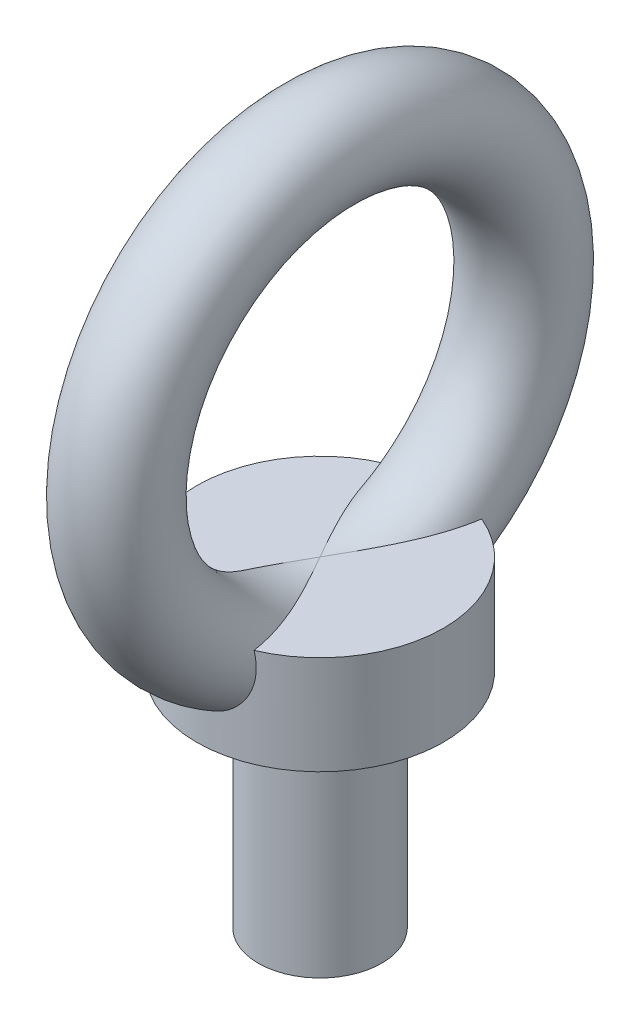
ISO-10303-21;
HEADER;
FILE_DESCRIPTION(('STEP AP214'),'2;1');
FILE_NAME('part.step','',(''),(''),'','','');
FILE_SCHEMA(('AUTOMOTIVE_DESIGN { 1 0 10303 214 1 1 1 1 }'));
ENDSEC;
DATA;
#1=APPLICATION_CONTEXT('core data for automotive mechanical design processes');
#2=APPLICATION_PROTOCOL_DEFINITION('international standard','automotive_design',2000,#1);
#3=PRODUCT_CONTEXT('',#1,'mechanical');
#4=PRODUCT('Part','Part','',(#3));
#5=PRODUCT_RELATED_PRODUCT_CATEGORY('part','',(#4));
#6=PRODUCT_DEFINITION_FORMATION('','',#4);
#7=PRODUCT_DEFINITION_CONTEXT('part definition',#1,'design');
#8=PRODUCT_DEFINITION('design','',#6,#7);
#9=PRODUCT_DEFINITION_SHAPE('','',#8);
#10=(LENGTH_UNIT() NAMED_UNIT(*) SI_UNIT(.MILLI.,.METRE.));
#11=(NAMED_UNIT(*) PLANE_ANGLE_UNIT() SI_UNIT($,.RADIAN.));
#12=(NAMED_UNIT(*) SI_UNIT($,.STERADIAN.) SOLID_ANGLE_UNIT());
#13=UNCERTAINTY_MEASURE_WITH_UNIT(LENGTH_MEASURE(1.E-05),#10,'distance_accuracy_value','');
#14=(GEOMETRIC_REPRESENTATION_CONTEXT(3) GLOBAL_UNCERTAINTY_ASSIGNED_CONTEXT((#13)) GLOBAL_UNIT_ASSIGNED_CONTEXT((#10,
#11,#12)) REPRESENTATION_CONTEXT('',''));
#15=CARTESIAN_POINT('',(0.,0.,0.));
#16=DIRECTION('',(0.,0.,1.));
#17=DIRECTION('',(1.,0.,0.));
#18=AXIS2_PLACEMENT_3D('',#15,#16,#17);
#19=CARTESIAN_POINT('',(0.,26.,0.));
#20=DIRECTION('',(0.,-1.,0.));
#21=DIRECTION('',(0.,0.,-1.));
#22=AXIS2_PLACEMENT_3D('',#19,#20,#21);
#23=CYLINDRICAL_SURFACE('',#22,10.);
#24=CARTESIAN_POINT('',(0.,18.,0.));
#25=DIRECTION('',(0.,1.,0.));
#26=DIRECTION('',(0.,0.,1.));
#27=AXIS2_PLACEMENT_3D('',#24,#25,#26);
#28=CIRCLE('',#27,10.);
#29=CARTESIAN_POINT('',(0.,18.,10.));
#30=VERTEX_POINT('',#29);
#31=EDGE_CURVE('E89',#30,#30,#28,.T.);
#32=ORIENTED_EDGE('',*,*,#31,.T.);
#33=EDGE_LOOP('',(#32));
#34=FACE_BOUND('',#33,.T.);
#35=CARTESIAN_POINT('',(-3.88064349287438,26.0002,9.2163228069123));
#36=CARTESIAN_POINT('',(-3.91196039614209,25.8346526435384,9.2031132141524));
#37=CARTESIAN_POINT('',(-3.9377468355017,25.6677461575926,9.1920877346792));
#38=CARTESIAN_POINT('',(-3.97679284751049,25.3316831758272,9.17527632259584));
#39=CARTESIAN_POINT('',(-3.99001141483859,25.1625211285319,9.16950754360304));
#40=CARTESIAN_POINT('',(-4.00227904493311,24.8222002399513,9.16415801935892));
#41=CARTESIAN_POINT('',(-4.00121825128295,24.6510360515955,9.16462524980636));
#42=CARTESIAN_POINT('',(-3.98296438350936,24.3099535983748,9.17257267387544));
#43=CARTESIAN_POINT('',(-3.96579427169415,24.1400339069715,9.18004288539808));
#44=CARTESIAN_POINT('',(-3.90508237990536,23.7474123049377,9.20607822246795));
#45=CARTESIAN_POINT('',(-3.8546866892703,23.5258802149485,9.22749980553656));
#46=CARTESIAN_POINT('',(-3.72011936751809,23.0957811313086,9.28255999274985));
#47=CARTESIAN_POINT('',(-3.63608417664122,22.8871656482326,9.3161491939095));
#48=CARTESIAN_POINT('',(-3.43347606158425,22.4878862601282,9.39270746799405));
#49=CARTESIAN_POINT('',(-3.31473514166373,22.2973157885782,9.43572190480782));
#50=CARTESIAN_POINT('',(-3.04505561548322,21.9413063748125,9.52616252870186));
#51=CARTESIAN_POINT('',(-2.89407719178817,21.7758989488116,9.57359413031776));
#52=CARTESIAN_POINT('',(-2.57374138883948,21.4835317307652,9.66446859682387));
#53=CARTESIAN_POINT('',(-2.40589332519128,21.3549338571835,9.70798583547898));
#54=CARTESIAN_POINT('',(-2.05027259552967,21.1269078571649,9.78925974713814));
#55=CARTESIAN_POINT('',(-1.86250550398213,21.0274715988373,9.82701802465073));
#56=CARTESIAN_POINT('',(-1.46896025500572,20.8578609498013,9.89356374905459));
#57=CARTESIAN_POINT('',(-1.26293697820869,20.7881938561671,9.92219371228241));
#58=CARTESIAN_POINT('',(-0.841290348906619,20.6814232313405,9.96680393360572));
#59=CARTESIAN_POINT('',(-0.625665572940123,20.6443245455497,9.98278230941246));
#60=CARTESIAN_POINT('',(-0.186546012618594,20.6027481409093,10.00071910478));
#61=CARTESIAN_POINT('',(0.0370204329112354,20.598906445925,10.0024041593507));
#62=CARTESIAN_POINT('',(0.481718669092495,20.6255595459239,9.99086745250504));
#63=CARTESIAN_POINT('',(0.702850313444376,20.6560563929554,9.97764480021397));
#64=CARTESIAN_POINT('',(1.13728068560241,20.7512110400273,9.93752325507795));
#65=CARTESIAN_POINT('',(1.35054526297542,20.8160024504415,9.91057088730976));
#66=CARTESIAN_POINT('',(1.76214779604898,20.9789664183982,9.84572284205066));
#67=CARTESIAN_POINT('',(1.96048632199552,21.0771376998797,9.80782758289796));
#68=CARTESIAN_POINT('',(2.3348152309233,21.3043588090008,9.72548719981718));
#69=CARTESIAN_POINT('',(2.51097610045453,21.4331478646519,9.68109854629415));
#70=CARTESIAN_POINT('',(2.83759378520881,21.7194563857794,9.59045562590868));
#71=CARTESIAN_POINT('',(2.98805543335756,21.8769704377652,9.54420171184892));
#72=CARTESIAN_POINT('',(3.25584219478341,22.212683441028,9.4561601238103));
#73=CARTESIAN_POINT('',(3.37387076479665,22.3903008317896,9.4142923503592));
#74=CARTESIAN_POINT('',(3.57900730415669,22.7638363658651,9.33824045073722));
#75=CARTESIAN_POINT('',(3.66613896033615,22.9597403437417,9.30405044588308));
#76=CARTESIAN_POINT('',(3.80947430171167,23.3642831956214,9.24629204367916));
#77=CARTESIAN_POINT('',(3.86562378920022,23.5729436812394,9.22274227244687));
#78=CARTESIAN_POINT('',(3.94868408190483,23.9974651604125,9.18748837665787));
#79=CARTESIAN_POINT('',(3.97551278238445,24.2133446378868,9.17581752195012));
#80=CARTESIAN_POINT('',(3.99745145238246,24.5618336262937,9.16626413959052));
#81=CARTESIAN_POINT('',(4.00087016869573,24.6939312726901,9.16477101558722));
#82=CARTESIAN_POINT('',(3.99875817363391,24.9581152713235,9.1656939647668));
#83=CARTESIAN_POINT('',(3.99322301231728,25.0902015852982,9.16811198172745));
#84=CARTESIAN_POINT('',(3.97403411751138,25.352725660753,9.1764461703054));
#85=CARTESIAN_POINT('',(3.9604365409228,25.4831685112383,9.18233814330471));
#86=CARTESIAN_POINT('',(3.92588037970864,25.742733739346,9.19716145616274));
#87=CARTESIAN_POINT('',(3.9049315024222,25.871857628367,9.20608878737207));
#88=CARTESIAN_POINT('',(3.88064349287438,26.0002,9.2163228069123));
#89=B_SPLINE_CURVE_WITH_KNOTS('',3,(#35,#36,#37,#38,#39,#40,#41,#42,#43,#44,#45,#46,#47,#48,#49,
#50,#51,#52,#53,#54,#55,#56,#57,#58,#59,#60,#61,#62,#63,#64,#65,#66,#67,#68,#69,#70,#71,#72,#73,
#74,#75,#76,#77,#78,#79,#80,#81,#82,#83,#84,#85,#86,#87,#88),.UNSPECIFIED.,.F.,.F.,(4,2,2,2,2,2,
2,2,2,2,2,2,2,2,2,2,2,2,2,2,2,2,2,2,2,2,4),(0.,0.507093586943615,1.01583605232818,
1.52849468443079,2.04042367859035,2.72200812170285,3.40085565532443,4.08304521879358,
4.76608229850311,5.41074115792405,6.05522007906405,6.71028149391714,7.36544034975854,
8.0331017572391,8.70080306583661,9.37112507168186,10.0414214550303,10.7062014615256,
11.3708563133241,12.0196914916596,12.6680281655865,13.3174954205979,13.9687767054113,
14.3649013407387,14.7612229045,15.1548158839207,15.5478910703901),.UNSPECIFIED.);
#90=CARTESIAN_POINT('',(-3.88068135601991,26.,9.21630686408821));
#91=VERTEX_POINT('',#90);
#92=CARTESIAN_POINT('',(3.88068135601991,26.,9.21630686408822));
#93=VERTEX_POINT('',#92);
#94=EDGE_CURVE('E57',#91,#93,#89,.T.);
#95=ORIENTED_EDGE('',*,*,#94,.F.);
#96=CARTESIAN_POINT('',(0.,26.,0.));
#97=DIRECTION('',(0.,1.,0.));
#98=DIRECTION('',(0.,0.,1.));
#99=AXIS2_PLACEMENT_3D('',#96,#97,#98);
#100=CIRCLE('',#99,10.);
#101=CARTESIAN_POINT('',(-3.88068135601991,26.,-9.21630686408822));
#102=VERTEX_POINT('',#101);
#103=EDGE_CURVE('E82',#102,#91,#100,.T.);
#104=ORIENTED_EDGE('',*,*,#103,.F.);
#105=CARTESIAN_POINT('',(3.88064349287438,26.0002,-9.2163228069123));
#106=CARTESIAN_POINT('',(3.91196039614209,25.8346526435384,-9.2031132141524));
#107=CARTESIAN_POINT('',(3.9377468355017,25.6677461575926,-9.1920877346792));
#108=CARTESIAN_POINT('',(3.97679284751049,25.3316831758272,-9.17527632259584));
#109=CARTESIAN_POINT('',(3.99001141483859,25.1625211285319,-9.16950754360304));
#110=CARTESIAN_POINT('',(4.00227904493311,24.8222002399513,-9.16415801935892));
#111=CARTESIAN_POINT('',(4.00121825128295,24.6510360515955,-9.16462524980636));
#112=CARTESIAN_POINT('',(3.98296438350936,24.3099535983748,-9.17257267387544));
#113=CARTESIAN_POINT('',(3.96579427169415,24.1400339069715,-9.18004288539808));
#114=CARTESIAN_POINT('',(3.90508237990536,23.7474123049377,-9.20607822246795));
#115=CARTESIAN_POINT('',(3.8546866892703,23.5258802149485,-9.22749980553656));
#116=CARTESIAN_POINT('',(3.72011936751809,23.0957811313086,-9.28255999274985));
#117=CARTESIAN_POINT('',(3.63608417664122,22.8871656482326,-9.3161491939095));
#118=CARTESIAN_POINT('',(3.43347606158425,22.4878862601282,-9.39270746799405));
#119=CARTESIAN_POINT('',(3.31473514166373,22.2973157885782,-9.43572190480782));
#120=CARTESIAN_POINT('',(3.04505561548322,21.9413063748125,-9.52616252870186));
#121=CARTESIAN_POINT('',(2.89407719178817,21.7758989488116,-9.57359413031776));
#122=CARTESIAN_POINT('',(2.57374138883948,21.4835317307652,-9.66446859682387));
#123=CARTESIAN_POINT('',(2.40589332519128,21.3549338571835,-9.70798583547898));
#124=CARTESIAN_POINT('',(2.05027259552967,21.1269078571649,-9.78925974713814));
#125=CARTESIAN_POINT('',(1.86250550398213,21.0274715988373,-9.82701802465073));
#126=CARTESIAN_POINT('',(1.46896025500572,20.8578609498013,-9.89356374905459));
#127=CARTESIAN_POINT('',(1.26293697820869,20.7881938561671,-9.92219371228241));
#128=CARTESIAN_POINT('',(0.841290348906619,20.6814232313405,-9.96680393360572));
#129=CARTESIAN_POINT('',(0.625665572940123,20.6443245455497,-9.98278230941246));
#130=CARTESIAN_POINT('',(0.186546012618594,20.6027481409093,-10.00071910478));
#131=CARTESIAN_POINT('',(-0.0370204329112354,20.598906445925,-10.0024041593507));
#132=CARTESIAN_POINT('',(-0.481718669092495,20.6255595459239,-9.99086745250504));
#133=CARTESIAN_POINT('',(-0.702850313444376,20.6560563929554,-9.97764480021397));
#134=CARTESIAN_POINT('',(-1.13728068560241,20.7512110400273,-9.93752325507795));
#135=CARTESIAN_POINT('',(-1.35054526297542,20.8160024504415,-9.91057088730976));
#136=CARTESIAN_POINT('',(-1.76214779604898,20.9789664183982,-9.84572284205066));
#137=CARTESIAN_POINT('',(-1.96048632199552,21.0771376998797,-9.80782758289796));
#138=CARTESIAN_POINT('',(-2.3348152309233,21.3043588090008,-9.72548719981718));
#139=CARTESIAN_POINT('',(-2.51097610045453,21.4331478646519,-9.68109854629415));
#140=CARTESIAN_POINT('',(-2.83759378520881,21.7194563857794,-9.59045562590868));
#141=CARTESIAN_POINT('',(-2.98805543335756,21.8769704377652,-9.54420171184892));
#142=CARTESIAN_POINT('',(-3.25584219478341,22.212683441028,-9.4561601238103));
#143=CARTESIAN_POINT('',(-3.37387076479665,22.3903008317896,-9.4142923503592));
#144=CARTESIAN_POINT('',(-3.57900730415669,22.7638363658651,-9.33824045073722));
#145=CARTESIAN_POINT('',(-3.66613896033615,22.9597403437417,-9.30405044588308));
#146=CARTESIAN_POINT('',(-3.80947430171167,23.3642831956214,-9.24629204367916));
#147=CARTESIAN_POINT('',(-3.86562378920022,23.5729436812394,-9.22274227244687));
#148=CARTESIAN_POINT('',(-3.94868408190483,23.9974651604125,-9.18748837665787));
#149=CARTESIAN_POINT('',(-3.97551278238445,24.2133446378868,-9.17581752195012));
#150=CARTESIAN_POINT('',(-3.99745145238246,24.5618336262937,-9.16626413959052));
#151=CARTESIAN_POINT('',(-4.00087016869573,24.6939312726901,-9.16477101558722));
#152=CARTESIAN_POINT('',(-3.99875817363391,24.9581152713235,-9.1656939647668));
#153=CARTESIAN_POINT('',(-3.99322301231728,25.0902015852982,-9.16811198172745));
#154=CARTESIAN_POINT('',(-3.97403411751138,25.352725660753,-9.1764461703054));
#155=CARTESIAN_POINT('',(-3.9604365409228,25.4831685112383,-9.18233814330471));
#156=CARTESIAN_POINT('',(-3.92588037970864,25.742733739346,-9.19716145616274));
#157=CARTESIAN_POINT('',(-3.9049315024222,25.871857628367,-9.20608878737207));
#158=CARTESIAN_POINT('',(-3.88064349287438,26.0002,-9.2163228069123));
#159=B_SPLINE_CURVE_WITH_KNOTS('',3,(#105,#106,#107,#108,#109,#110,#111,#112,#113,#114,#115,
#116,#117,#118,#119,#120,#121,#122,#123,#124,#125,#126,#127,#128,#129,#130,#131,#132,#133,#134,
#135,#136,#137,#138,#139,#140,#141,#142,#143,#144,#145,#146,#147,#148,#149,#150,#151,#152,#153,
#154,#155,#156,#157,#158),.UNSPECIFIED.,.F.,.F.,(4,2,2,2,2,2,2,2,2,2,2,2,2,2,2,2,2,2,2,2,2,2,2,
2,2,2,4),(0.,0.507093586943615,1.01583605232818,1.52849468443079,2.04042367859035,
2.72200812170285,3.40085565532443,4.08304521879358,4.76608229850311,5.41074115792405,
6.05522007906405,6.71028149391714,7.36544034975854,8.0331017572391,8.70080306583661,
9.37112507168186,10.0414214550303,10.7062014615256,11.3708563133241,12.0196914916596,
12.6680281655865,13.3174954205979,13.9687767054113,14.3649013407387,14.7612229045,
15.1548158839207,15.5478910703901),.UNSPECIFIED.);
#160=CARTESIAN_POINT('',(3.88068135601991,26.,-9.21630686408821));
#161=VERTEX_POINT('',#160);
#162=EDGE_CURVE('E70',#161,#102,#159,.T.);
#163=ORIENTED_EDGE('',*,*,#162,.F.);
#164=EDGE_CURVE('E80',#93,#161,#100,.T.);
#165=ORIENTED_EDGE('',*,*,#164,.F.);
#166=EDGE_LOOP('',(#95,#104,#163,#165));
#167=FACE_BOUND('',#166,.T.);
#168=ADVANCED_FACE('F34',(#34,#167),#23,.T.);
#169=CARTESIAN_POINT('',(0.,26.,0.));
#170=DIRECTION('',(0.,1.,0.));
#171=DIRECTION('',(0.,0.,1.));
#172=AXIS2_PLACEMENT_3D('',#169,#170,#171);
#173=PLANE('',#172);
#174=CARTESIAN_POINT('',(0.,26.,0.));
#175=CARTESIAN_POINT('',(-0.000166056917077025,26.,-2.27428896951194E-07));
#176=CARTESIAN_POINT('',(-0.000332112713534952,26.,-0.000486213943571419));
#177=CARTESIAN_POINT('',(-0.000789972824092385,26.,-0.00157191238178184));
#178=CARTESIAN_POINT('',(-0.00108181284626674,26.,-0.00197923118660756));
#179=CARTESIAN_POINT('',(-0.00218304290348033,26.,-0.00366641815309157));
#180=CARTESIAN_POINT('',(-0.00299157646332964,26.,-0.00521172023225186));
#181=CARTESIAN_POINT('',(-0.00620210888540527,26.,-0.0111916185735535));
#182=CARTESIAN_POINT('',(-0.00860590018555383,26.,-0.0153219736224391));
#183=CARTESIAN_POINT('',(-0.0551184505041103,26.,-0.0954415066860866));
#184=CARTESIAN_POINT('',(-0.0992056355101666,26.,-0.174838613828487));
#185=CARTESIAN_POINT('',(-0.187904331257217,26.,-0.33281956486444));
#186=CARTESIAN_POINT('',(-0.232515482642256,26.,-0.411380717299586));
#187=CARTESIAN_POINT('',(-0.322016679641999,26.,-0.569680449884074));
#188=CARTESIAN_POINT('',(-0.366906071161782,26.,-0.649423415695625));
#189=CARTESIAN_POINT('',(-0.456418510432044,26.,-0.80857731540423));
#190=CARTESIAN_POINT('',(-0.501041947298054,26.,-0.887988470490917));
#191=CARTESIAN_POINT('',(-0.631550593050782,26.,-1.12080909309244));
#192=CARTESIAN_POINT('',(-0.717223936472606,26.,-1.27437105439887));
#193=CARTESIAN_POINT('',(-0.887424547485829,26.,-1.58142821507369));
#194=CARTESIAN_POINT('',(-0.971954705499242,26.,-1.73492189351658));
#195=CARTESIAN_POINT('',(-1.14859290088483,26.,-2.05849745421302));
#196=CARTESIAN_POINT('',(-1.24057706228381,26.,-2.22864785130287));
#197=CARTESIAN_POINT('',(-1.42285603621784,26.,-2.57005487595487));
#198=CARTESIAN_POINT('',(-1.51314916391592,26.,-2.74131239958939));
#199=CARTESIAN_POINT('',(-1.78227317348977,26.,-3.25970880687869));
#200=CARTESIAN_POINT('',(-1.95776577153967,26.,-3.60860378150749));
#201=CARTESIAN_POINT('',(-2.25731745704299,26.,-4.2313249894588));
#202=CARTESIAN_POINT('',(-2.38391159083314,26.,-4.50392813541345));
#203=CARTESIAN_POINT('',(-2.62768147406032,26.,-5.05263182091982));
#204=CARTESIAN_POINT('',(-2.74487701938838,26.,-5.3287235116721));
#205=CARTESIAN_POINT('',(-2.96596169295118,26.,-5.87980996346486));
#206=CARTESIAN_POINT('',(-3.07007009533581,26.,-6.15471619869146));
#207=CARTESIAN_POINT('',(-3.26563845483153,26.,-6.70913665139231));
#208=CARTESIAN_POINT('',(-3.35709358447804,26.,-6.98865258228471));
#209=CARTESIAN_POINT('',(-3.53567042108341,26.,-7.5879456858417));
#210=CARTESIAN_POINT('',(-3.62077198706239,26.,-7.90833360889996));
#211=CARTESIAN_POINT('',(-3.76857912068309,26.,-8.55594077690071));
#212=CARTESIAN_POINT('',(-3.83117488024516,26.,-8.88318548644351));
#213=CARTESIAN_POINT('',(-3.93102481894134,26.,-9.55505170133459));
#214=CARTESIAN_POINT('',(-3.96716426099486,26.,-9.89984441966192));
#215=CARTESIAN_POINT('',(-4.0042556711475,26.,-10.5907738709089));
#216=CARTESIAN_POINT('',(-4.0052844674929,26.,-10.936906011582));
#217=CARTESIAN_POINT('',(-3.96667408142943,26.,-11.6157065444616));
#218=CARTESIAN_POINT('',(-3.9283663454116,26.,-11.9484444732282));
#219=CARTESIAN_POINT('',(-3.80715364907125,26.,-12.6036211686394));
#220=CARTESIAN_POINT('',(-3.72459206235551,26.,-12.9261192469508));
#221=CARTESIAN_POINT('',(-3.56208095988702,26.,-13.3993133625873));
#222=CARTESIAN_POINT('',(-3.50080337892693,26.,-13.5565228450514));
#223=CARTESIAN_POINT('',(-3.3644521314186,26.,-13.8649438841072));
#224=CARTESIAN_POINT('',(-3.28937604822887,26.,-14.0161543844004));
#225=CARTESIAN_POINT('',(-3.12487684272533,26.,-14.3104975653386));
#226=CARTESIAN_POINT('',(-3.03546275874978,26.,-14.4536352585578));
#227=CARTESIAN_POINT('',(-2.84199840592725,26.,-14.7295179130279));
#228=CARTESIAN_POINT('',(-2.73795794500427,26.,-14.8622697465671));
#229=CARTESIAN_POINT('',(-2.48554245819087,26.,-15.1483691643525));
#230=CARTESIAN_POINT('',(-2.33271611737907,26.,-15.2978933298156));
#231=CARTESIAN_POINT('',(-2.0869663437308,26.,-15.5019927821111));
#232=CARTESIAN_POINT('',(-2.00228150512537,26.,-15.566671177411));
#233=CARTESIAN_POINT('',(-1.8277161762737,26.,-15.688559958643));
#234=CARTESIAN_POINT('',(-1.73783817671664,26.,-15.7457738824069));
#235=CARTESIAN_POINT('',(-1.55257986837542,26.,-15.852400641025));
#236=CARTESIAN_POINT('',(-1.45716056129616,26.,-15.9017458273733));
#237=CARTESIAN_POINT('',(-1.2621666192571,26.,-15.9912932564072));
#238=CARTESIAN_POINT('',(-1.16259403329843,26.,-16.0314999458391));
#239=CARTESIAN_POINT('',(-0.960053366723018,26.,-16.1021191699875));
#240=CARTESIAN_POINT('',(-0.857086127125317,26.,-16.1325341107863));
#241=CARTESIAN_POINT('',(-0.648651303566089,26.,-16.1830354979379));
#242=CARTESIAN_POINT('',(-0.543184059487788,26.,-16.2031233399616));
#243=CARTESIAN_POINT('',(-0.343459524567437,26.,-16.2308382323078));
#244=CARTESIAN_POINT('',(-0.249367351747387,26.,-16.2396667257311));
#245=CARTESIAN_POINT('',(-0.0607370186774117,26.,-16.2489005970968));
#246=CARTESIAN_POINT('',(0.0338012752043173,26.,-16.249303266698));
#247=CARTESIAN_POINT('',(0.222476716363201,26.,-16.2416697684387));
#248=CARTESIAN_POINT('',(0.316614090802839,26.,-16.2336392800401));
#249=CARTESIAN_POINT('',(0.503819625596486,26.,-16.2092792767363));
#250=CARTESIAN_POINT('',(0.596887374577546,26.,-16.1929466713503));
#251=CARTESIAN_POINT('',(0.863684226735637,26.,-16.1339532460503));
#252=CARTESIAN_POINT('',(1.03520239805141,26.,-16.0808065731741));
#253=CARTESIAN_POINT('',(1.36751688233536,26.,-15.9480922823371));
#254=CARTESIAN_POINT('',(1.52831204208081,26.,-15.8685218280751));
#255=CARTESIAN_POINT('',(1.84559573646379,26.,-15.680871026912));
#256=CARTESIAN_POINT('',(2.00123046934397,26.,-15.5713533523878));
#257=CARTESIAN_POINT('',(2.29492019371752,26.,-15.3308825485818));
#258=CARTESIAN_POINT('',(2.43296723795981,26.,-15.199919789681));
#259=CARTESIAN_POINT('',(2.65268754223606,26.,-14.9618324195378));
#260=CARTESIAN_POINT('',(2.73903524124565,26.,-14.8589487136072));
#261=CARTESIAN_POINT('',(2.90239730658001,26.,-14.6459946742666));
#262=CARTESIAN_POINT('',(2.9794087017062,26.,-14.5359220701102));
#263=CARTESIAN_POINT('',(3.19679332455463,26.,-14.1964084060464));
#264=CARTESIAN_POINT('',(3.32324905478491,26.,-13.9579695378751));
#265=CARTESIAN_POINT('',(3.5801849493892,26.,-13.377200836751));
#266=CARTESIAN_POINT('',(3.69573020925908,26.,-13.0283680693388));
#267=CARTESIAN_POINT('',(3.86954550272496,26.,-12.3182371500878));
#268=CARTESIAN_POINT('',(3.92794671052051,26.,-11.956969526955));
#269=CARTESIAN_POINT('',(3.98773004853176,26.,-11.3222791672224));
#270=CARTESIAN_POINT('',(3.99979742181963,26.,-11.0497478280049));
#271=CARTESIAN_POINT('',(4.00019763252217,26.,-10.5045375493755));
#272=CARTESIAN_POINT('',(3.98851516956472,26.,-10.2318586280261));
#273=CARTESIAN_POINT('',(3.9439336445503,26.,-9.68310378345497));
#274=CARTESIAN_POINT('',(3.91063577271867,26.,-9.40706172470787));
#275=CARTESIAN_POINT('',(3.82525988572934,26.,-8.85787349545509));
#276=CARTESIAN_POINT('',(3.77317619657221,26.,-8.58472822557078));
#277=CARTESIAN_POINT('',(3.63974435139488,26.,-7.98345798332718));
#278=CARTESIAN_POINT('',(3.55450496232478,26.,-7.65620242397203));
#279=CARTESIAN_POINT('',(3.3640005930295,26.,-7.00765717219444));
#280=CARTESIAN_POINT('',(3.258735104997,26.,-6.6863676312808));
#281=CARTESIAN_POINT('',(3.0311778586097,26.,-6.04838740081846));
#282=CARTESIAN_POINT('',(2.9088155863086,26.,-5.73172208406428));
#283=CARTESIAN_POINT('',(2.65048291837209,26.,-5.10397413324394));
#284=CARTESIAN_POINT('',(2.51451007141198,26.,-4.79289251676792));
#285=CARTESIAN_POINT('',(2.11502849890294,26.,-3.9209553024252));
#286=CARTESIAN_POINT('',(1.83890244317633,26.,-3.36591100837649));
#287=CARTESIAN_POINT('',(1.26817340748785,26.,-2.27283314649376));
#288=CARTESIAN_POINT('',(0.973785822255019,26.,-1.73468424369889));
#289=CARTESIAN_POINT('',(0.627705225939032,26.,-1.1141105688379));
#290=CARTESIAN_POINT('',(0.580248723492809,26.,-1.02927198960689));
#291=CARTESIAN_POINT('',(0.484011515853,26.,-0.857626787997864));
#292=CARTESIAN_POINT('',(0.43522656855294,26.,-0.770822248400845));
#293=CARTESIAN_POINT('',(0.353713348159059,26.,-0.62607934559024));
#294=CARTESIAN_POINT('',(0.321021338744144,26.,-0.568107404589191));
#295=CARTESIAN_POINT('',(0.255872713180301,26.,-0.452584009355633));
#296=CARTESIAN_POINT('',(0.223416462193014,26.,-0.395033176525008));
#297=CARTESIAN_POINT('',(0.16144956860034,26.,-0.285570487644897));
#298=CARTESIAN_POINT('',(0.131941597239684,26.,-0.233625251243682));
#299=CARTESIAN_POINT('',(0.071963906726899,26.,-0.126859571406324));
#300=CARTESIAN_POINT('',(0.0414940045048496,26.,-0.0720005019498684));
#301=CARTESIAN_POINT('',(0.00861011250990449,26.,-0.0153270577133963));
#302=CARTESIAN_POINT('',(0.00621050811065863,26.,-0.0112060164956609));
#303=CARTESIAN_POINT('',(0.00300112435548098,26.,-0.00522832620750213));
#304=CARTESIAN_POINT('',(0.00218953677515901,26.,-0.00367674785333279));
#305=CARTESIAN_POINT('',(0.00108434044965541,26.,-0.00198403097023465));
#306=CARTESIAN_POINT('',(0.00079159851887479,26.,-0.00157567888054489));
#307=CARTESIAN_POINT('',(0.000332593883785078,26.,-0.000486705562970888));
#308=CARTESIAN_POINT('',(0.000166296379965832,26.,2.27756861492633E-07));
#309=CARTESIAN_POINT('',(0.,26.,0.));
#310=B_SPLINE_CURVE_WITH_KNOTS('',3,(#174,#175,#176,#177,#178,#179,#180,#181,#182,#183,#184,
#185,#186,#187,#188,#189,#190,#191,#192,#193,#194,#195,#196,#197,#198,#199,#200,#201,#202,#203,
#204,#205,#206,#207,#208,#209,#210,#211,#212,#213,#214,#215,#216,#217,#218,#219,#220,#221,#222,
#223,#224,#225,#226,#227,#228,#229,#230,#231,#232,#233,#234,#235,#236,#237,#238,#239,#240,#241,
#242,#243,#244,#245,#246,#247,#248,#249,#250,#251,#252,#253,#254,#255,#256,#257,#258,#259,#260,
#261,#262,#263,#264,#265,#266,#267,#268,#269,#270,#271,#272,#273,#274,#275,#276,#277,#278,#279,
#280,#281,#282,#283,#284,#285,#286,#287,#288,#289,#290,#291,#292,#293,#294,#295,#296,#297,#298,
#299,#300,#301,#302,#303,#304,#305,#306,#307,#308,#309),.UNSPECIFIED.,.T.,.F.,(4,2,2,2,2,2,2,2,
2,2,2,2,2,2,2,2,2,2,2,2,2,2,2,2,2,2,2,2,2,2,2,2,2,2,2,2,2,2,2,2,2,2,2,2,2,2,2,2,2,2,2,2,2,2,2,2,
2,2,2,2,2,2,2,2,2,2,2,4),(0.,0.00101124310648672,0.00278797963373057,0.00771852382417234,
0.0223606800234551,0.2910468783616,0.563103150288099,0.837354592250593,1.11069248100283,
1.63817239534549,2.16387365379711,2.74412660352347,3.32492984092652,4.4963610635065,
5.39792011270126,6.29752744266199,7.17914011808316,8.06108822346038,9.05487457212926,
10.0534459307415,11.0919904335952,12.1282622730169,13.1305790186709,14.1252288625283,
14.6308667613384,15.1365933010698,15.6420022869467,16.1470739660466,16.7855705001012,
17.1049324295174,17.4241424412279,17.7459638567182,18.0676283386807,18.3892137190449,
18.71075562685,18.993905259721,19.2771459049443,19.560195918921,19.8433513761217,
20.3794465013243,20.9155991890285,21.4842950274937,22.0532469347864,22.4556847062142,
22.8582502156725,23.6645679852311,24.7611141740882,25.8551372938411,26.6724673653534,
27.4903241527967,28.3237167450796,29.157361263282,30.1710883812323,31.184841207969,
32.2029058561537,33.2211541933306,35.0800170140882,36.9200581818133,37.211693106203,
37.5103889440794,37.7101044714492,37.9081199222717,38.0879864164318,38.2736808254488,
38.288297376838,38.2932465853213,38.2950288041054,38.2960415054781),.UNSPECIFIED.);
#311=CARTESIAN_POINT('',(0.,26.,0.));
#312=VERTEX_POINT('',#311);
#313=EDGE_CURVE('E67',#161,#312,#310,.T.);
#314=ORIENTED_EDGE('',*,*,#313,.T.);
#315=CARTESIAN_POINT('',(0.,26.,0.));
#316=CARTESIAN_POINT('',(0.000166056917077025,26.,2.27428896951194E-07));
#317=CARTESIAN_POINT('',(0.000332112713534952,26.,0.000486213943571419));
#318=CARTESIAN_POINT('',(0.000789972824092385,26.,0.00157191238178184));
#319=CARTESIAN_POINT('',(0.00108181284626674,26.,0.00197923118660756));
#320=CARTESIAN_POINT('',(0.00218304290348033,26.,0.00366641815309157));
#321=CARTESIAN_POINT('',(0.00299157646332964,26.,0.00521172023225186));
#322=CARTESIAN_POINT('',(0.00620210888540527,26.,0.0111916185735535));
#323=CARTESIAN_POINT('',(0.00860590018555383,26.,0.0153219736224391));
#324=CARTESIAN_POINT('',(0.0551184505041103,26.,0.0954415066860866));
#325=CARTESIAN_POINT('',(0.0992056355101666,26.,0.174838613828487));
#326=CARTESIAN_POINT('',(0.187904331257217,26.,0.33281956486444));
#327=CARTESIAN_POINT('',(0.232515482642256,26.,0.411380717299586));
#328=CARTESIAN_POINT('',(0.322016679641999,26.,0.569680449884074));
#329=CARTESIAN_POINT('',(0.366906071161782,26.,0.649423415695625));
#330=CARTESIAN_POINT('',(0.456418510432044,26.,0.80857731540423));
#331=CARTESIAN_POINT('',(0.501041947298054,26.,0.887988470490917));
#332=CARTESIAN_POINT('',(0.631550593050782,26.,1.12080909309244));
#333=CARTESIAN_POINT('',(0.717223936472606,26.,1.27437105439887));
#334=CARTESIAN_POINT('',(0.887424547485829,26.,1.58142821507369));
#335=CARTESIAN_POINT('',(0.971954705499242,26.,1.73492189351658));
#336=CARTESIAN_POINT('',(1.14859290088483,26.,2.05849745421302));
#337=CARTESIAN_POINT('',(1.24057706228381,26.,2.22864785130287));
#338=CARTESIAN_POINT('',(1.42285603621784,26.,2.57005487595487));
#339=CARTESIAN_POINT('',(1.51314916391592,26.,2.74131239958939));
#340=CARTESIAN_POINT('',(1.78227317348977,26.,3.25970880687869));
#341=CARTESIAN_POINT('',(1.95776577153967,26.,3.60860378150749));
#342=CARTESIAN_POINT('',(2.25731745704299,26.,4.2313249894588));
#343=CARTESIAN_POINT('',(2.38391159083314,26.,4.50392813541345));
#344=CARTESIAN_POINT('',(2.62768147406032,26.,5.05263182091982));
#345=CARTESIAN_POINT('',(2.74487701938838,26.,5.3287235116721));
#346=CARTESIAN_POINT('',(2.96596169295118,26.,5.87980996346486));
#347=CARTESIAN_POINT('',(3.07007009533581,26.,6.15471619869146));
#348=CARTESIAN_POINT('',(3.26563845483153,26.,6.70913665139231));
#349=CARTESIAN_POINT('',(3.35709358447804,26.,6.98865258228471));
#350=CARTESIAN_POINT('',(3.53567042108341,26.,7.5879456858417));
#351=CARTESIAN_POINT('',(3.62077198706239,26.,7.90833360889996));
#352=CARTESIAN_POINT('',(3.76857912068309,26.,8.55594077690071));
#353=CARTESIAN_POINT('',(3.83117488024516,26.,8.88318548644351));
#354=CARTESIAN_POINT('',(3.93102481894134,26.,9.55505170133459));
#355=CARTESIAN_POINT('',(3.96716426099486,26.,9.89984441966192));
#356=CARTESIAN_POINT('',(4.0042556711475,26.,10.5907738709089));
#357=CARTESIAN_POINT('',(4.0052844674929,26.,10.936906011582));
#358=CARTESIAN_POINT('',(3.96667408142943,26.,11.6157065444616));
#359=CARTESIAN_POINT('',(3.9283663454116,26.,11.9484444732282));
#360=CARTESIAN_POINT('',(3.80715364907125,26.,12.6036211686394));
#361=CARTESIAN_POINT('',(3.72459206235551,26.,12.9261192469508));
#362=CARTESIAN_POINT('',(3.56208095988702,26.,13.3993133625873));
#363=CARTESIAN_POINT('',(3.50080337892693,26.,13.5565228450514));
#364=CARTESIAN_POINT('',(3.3644521314186,26.,13.8649438841072));
#365=CARTESIAN_POINT('',(3.28937604822887,26.,14.0161543844004));
#366=CARTESIAN_POINT('',(3.12487684272533,26.,14.3104975653386));
#367=CARTESIAN_POINT('',(3.03546275874978,26.,14.4536352585578));
#368=CARTESIAN_POINT('',(2.84199840592725,26.,14.7295179130279));
#369=CARTESIAN_POINT('',(2.73795794500427,26.,14.8622697465671));
#370=CARTESIAN_POINT('',(2.48554245819087,26.,15.1483691643525));
#371=CARTESIAN_POINT('',(2.33271611737907,26.,15.2978933298156));
#372=CARTESIAN_POINT('',(2.0869663437308,26.,15.5019927821111));
#373=CARTESIAN_POINT('',(2.00228150512537,26.,15.566671177411));
#374=CARTESIAN_POINT('',(1.8277161762737,26.,15.688559958643));
#375=CARTESIAN_POINT('',(1.73783817671664,26.,15.7457738824069));
#376=CARTESIAN_POINT('',(1.55257986837542,26.,15.852400641025));
#377=CARTESIAN_POINT('',(1.45716056129616,26.,15.9017458273733));
#378=CARTESIAN_POINT('',(1.2621666192571,26.,15.9912932564072));
#379=CARTESIAN_POINT('',(1.16259403329843,26.,16.0314999458391));
#380=CARTESIAN_POINT('',(0.960053366723018,26.,16.1021191699875));
#381=CARTESIAN_POINT('',(0.857086127125317,26.,16.1325341107863));
#382=CARTESIAN_POINT('',(0.648651303566089,26.,16.1830354979379));
#383=CARTESIAN_POINT('',(0.543184059487788,26.,16.2031233399616));
#384=CARTESIAN_POINT('',(0.343459524567437,26.,16.2308382323078));
#385=CARTESIAN_POINT('',(0.249367351747387,26.,16.2396667257311));
#386=CARTESIAN_POINT('',(0.0607370186774117,26.,16.2489005970968));
#387=CARTESIAN_POINT('',(-0.0338012752043173,26.,16.249303266698));
#388=CARTESIAN_POINT('',(-0.222476716363201,26.,16.2416697684387));
#389=CARTESIAN_POINT('',(-0.316614090802839,26.,16.2336392800401));
#390=CARTESIAN_POINT('',(-0.503819625596486,26.,16.2092792767363));
#391=CARTESIAN_POINT('',(-0.596887374577546,26.,16.1929466713503));
#392=CARTESIAN_POINT('',(-0.863684226735637,26.,16.1339532460503));
#393=CARTESIAN_POINT('',(-1.03520239805141,26.,16.0808065731741));
#394=CARTESIAN_POINT('',(-1.36751688233536,26.,15.9480922823371));
#395=CARTESIAN_POINT('',(-1.52831204208081,26.,15.8685218280751));
#396=CARTESIAN_POINT('',(-1.84559573646379,26.,15.680871026912));
#397=CARTESIAN_POINT('',(-2.00123046934397,26.,15.5713533523878));
#398=CARTESIAN_POINT('',(-2.29492019371752,26.,15.3308825485818));
#399=CARTESIAN_POINT('',(-2.43296723795981,26.,15.199919789681));
#400=CARTESIAN_POINT('',(-2.65268754223606,26.,14.9618324195378));
#401=CARTESIAN_POINT('',(-2.73903524124565,26.,14.8589487136072));
#402=CARTESIAN_POINT('',(-2.90239730658001,26.,14.6459946742666));
#403=CARTESIAN_POINT('',(-2.9794087017062,26.,14.5359220701102));
#404=CARTESIAN_POINT('',(-3.19679332455463,26.,14.1964084060464));
#405=CARTESIAN_POINT('',(-3.32324905478491,26.,13.9579695378751));
#406=CARTESIAN_POINT('',(-3.5801849493892,26.,13.377200836751));
#407=CARTESIAN_POINT('',(-3.69573020925908,26.,13.0283680693388));
#408=CARTESIAN_POINT('',(-3.86954550272496,26.,12.3182371500878));
#409=CARTESIAN_POINT('',(-3.92794671052051,26.,11.956969526955));
#410=CARTESIAN_POINT('',(-3.98773004853176,26.,11.3222791672224));
#411=CARTESIAN_POINT('',(-3.99979742181963,26.,11.0497478280049));
#412=CARTESIAN_POINT('',(-4.00019763252217,26.,10.5045375493755));
#413=CARTESIAN_POINT('',(-3.98851516956472,26.,10.2318586280261));
#414=CARTESIAN_POINT('',(-3.9439336445503,26.,9.68310378345497));
#415=CARTESIAN_POINT('',(-3.91063577271867,26.,9.40706172470787));
#416=CARTESIAN_POINT('',(-3.82525988572934,26.,8.85787349545509));
#417=CARTESIAN_POINT('',(-3.77317619657221,26.,8.58472822557078));
#418=CARTESIAN_POINT('',(-3.63974435139488,26.,7.98345798332718));
#419=CARTESIAN_POINT('',(-3.55450496232478,26.,7.65620242397203));
#420=CARTESIAN_POINT('',(-3.3640005930295,26.,7.00765717219444));
#421=CARTESIAN_POINT('',(-3.258735104997,26.,6.6863676312808));
#422=CARTESIAN_POINT('',(-3.0311778586097,26.,6.04838740081846));
#423=CARTESIAN_POINT('',(-2.9088155863086,26.,5.73172208406428));
#424=CARTESIAN_POINT('',(-2.65048291837209,26.,5.10397413324394));
#425=CARTESIAN_POINT('',(-2.51451007141198,26.,4.79289251676792));
#426=CARTESIAN_POINT('',(-2.11502849890294,26.,3.9209553024252));
#427=CARTESIAN_POINT('',(-1.83890244317633,26.,3.36591100837649));
#428=CARTESIAN_POINT('',(-1.26817340748785,26.,2.27283314649376));
#429=CARTESIAN_POINT('',(-0.973785822255019,26.,1.73468424369889));
#430=CARTESIAN_POINT('',(-0.627705225939032,26.,1.1141105688379));
#431=CARTESIAN_POINT('',(-0.580248723492809,26.,1.02927198960689));
#432=CARTESIAN_POINT('',(-0.484011515853,26.,0.857626787997864));
#433=CARTESIAN_POINT('',(-0.43522656855294,26.,0.770822248400845));
#434=CARTESIAN_POINT('',(-0.353713348159059,26.,0.62607934559024));
#435=CARTESIAN_POINT('',(-0.321021338744144,26.,0.568107404589191));
#436=CARTESIAN_POINT('',(-0.255872713180301,26.,0.452584009355633));
#437=CARTESIAN_POINT('',(-0.223416462193014,26.,0.395033176525008));
#438=CARTESIAN_POINT('',(-0.16144956860034,26.,0.285570487644897));
#439=CARTESIAN_POINT('',(-0.131941597239684,26.,0.233625251243682));
#440=CARTESIAN_POINT('',(-0.071963906726899,26.,0.126859571406324));
#441=CARTESIAN_POINT('',(-0.0414940045048496,26.,0.0720005019498684));
#442=CARTESIAN_POINT('',(-0.00861011250990449,26.,0.0153270577133963));
#443=CARTESIAN_POINT('',(-0.00621050811065863,26.,0.0112060164956609));
#444=CARTESIAN_POINT('',(-0.00300112435548098,26.,0.00522832620750213));
#445=CARTESIAN_POINT('',(-0.00218953677515901,26.,0.00367674785333279));
#446=CARTESIAN_POINT('',(-0.00108434044965541,26.,0.00198403097023465));
#447=CARTESIAN_POINT('',(-0.00079159851887479,26.,0.00157567888054489));
#448=CARTESIAN_POINT('',(-0.000332593883785078,26.,0.000486705562970888));
#449=CARTESIAN_POINT('',(-0.000166296379965832,26.,-2.27756861492633E-07));
#450=CARTESIAN_POINT('',(0.,26.,0.));
#451=B_SPLINE_CURVE_WITH_KNOTS('',3,(#315,#316,#317,#318,#319,#320,#321,#322,#323,#324,#325,
#326,#327,#328,#329,#330,#331,#332,#333,#334,#335,#336,#337,#338,#339,#340,#341,#342,#343,#344,
#345,#346,#347,#348,#349,#350,#351,#352,#353,#354,#355,#356,#357,#358,#359,#360,#361,#362,#363,
#364,#365,#366,#367,#368,#369,#370,#371,#372,#373,#374,#375,#376,#377,#378,#379,#380,#381,#382,
#383,#384,#385,#386,#387,#388,#389,#390,#391,#392,#393,#394,#395,#396,#397,#398,#399,#400,#401,
#402,#403,#404,#405,#406,#407,#408,#409,#410,#411,#412,#413,#414,#415,#416,#417,#418,#419,#420,
#421,#422,#423,#424,#425,#426,#427,#428,#429,#430,#431,#432,#433,#434,#435,#436,#437,#438,#439,
#440,#441,#442,#443,#444,#445,#446,#447,#448,#449,#450),.UNSPECIFIED.,.T.,.F.,(4,2,2,2,2,2,2,2,
2,2,2,2,2,2,2,2,2,2,2,2,2,2,2,2,2,2,2,2,2,2,2,2,2,2,2,2,2,2,2,2,2,2,2,2,2,2,2,2,2,2,2,2,2,2,2,2,
2,2,2,2,2,2,2,2,2,2,2,4),(0.,0.00101124310648672,0.00278797963373057,0.00771852382417234,
0.0223606800234551,0.2910468783616,0.563103150288099,0.837354592250593,1.11069248100283,
1.63817239534549,2.16387365379711,2.74412660352347,3.32492984092652,4.4963610635065,
5.39792011270126,6.29752744266199,7.17914011808316,8.06108822346038,9.05487457212926,
10.0534459307415,11.0919904335952,12.1282622730169,13.1305790186709,14.1252288625283,
14.6308667613384,15.1365933010698,15.6420022869467,16.1470739660466,16.7855705001012,
17.1049324295174,17.4241424412279,17.7459638567182,18.0676283386807,18.3892137190449,
18.71075562685,18.993905259721,19.2771459049443,19.560195918921,19.8433513761217,
20.3794465013243,20.9155991890285,21.4842950274937,22.0532469347864,22.4556847062142,
22.8582502156725,23.6645679852311,24.7611141740882,25.8551372938411,26.6724673653534,
27.4903241527967,28.3237167450796,29.157361263282,30.1710883812323,31.184841207969,
32.2029058561537,33.2211541933306,35.0800170140882,36.9200581818133,37.211693106203,
37.5103889440794,37.7101044714492,37.9081199222717,38.0879864164318,38.2736808254488,
38.288297376838,38.2932465853213,38.2950288041054,38.2960415054781),.UNSPECIFIED.);
#452=EDGE_CURVE('E11',#312,#93,#451,.T.);
#453=ORIENTED_EDGE('',*,*,#452,.T.);
#454=ORIENTED_EDGE('',*,*,#164,.T.);
#455=EDGE_LOOP('',(#314,#453,#454));
#456=FACE_BOUND('',#455,.T.);
#457=ADVANCED_FACE('F84',(#456),#173,.T.);
#458=ORIENTED_EDGE('',*,*,#103,.T.);
#459=EDGE_CURVE('E38',#91,#312,#451,.T.);
#460=ORIENTED_EDGE('',*,*,#459,.T.);
#461=EDGE_CURVE('E72',#312,#102,#310,.T.);
#462=ORIENTED_EDGE('',*,*,#461,.T.);
#463=EDGE_LOOP('',(#458,#460,#462));
#464=FACE_BOUND('',#463,.T.);
#465=ADVANCED_FACE('F128',(#464),#173,.T.);
#466=CARTESIAN_POINT('',(0.,18.,0.));
#467=DIRECTION('',(0.,-1.,0.));
#468=DIRECTION('',(0.,0.,-1.));
#469=AXIS2_PLACEMENT_3D('',#466,#467,#468);
#470=CYLINDRICAL_SURFACE('',#469,5.);
#471=CARTESIAN_POINT('',(0.,18.,0.));
#472=DIRECTION('',(0.,1.,0.));
#473=DIRECTION('',(0.,0.,1.));
#474=AXIS2_PLACEMENT_3D('',#471,#472,#473);
#475=CIRCLE('',#474,5.);
#476=CARTESIAN_POINT('',(0.,18.,5.));
#477=VERTEX_POINT('',#476);
#478=EDGE_CURVE('E76',#477,#477,#475,.T.);
#479=ORIENTED_EDGE('',*,*,#478,.F.);
#480=EDGE_LOOP('',(#479));
#481=FACE_BOUND('',#480,.T.);
#482=CARTESIAN_POINT('',(0.,0.,0.));
#483=DIRECTION('',(0.,1.,0.));
#484=DIRECTION('',(0.,0.,1.));
#485=AXIS2_PLACEMENT_3D('',#482,#483,#484);
#486=CIRCLE('',#485,5.);
#487=CARTESIAN_POINT('',(0.,0.,5.));
#488=VERTEX_POINT('',#487);
#489=EDGE_CURVE('E85',#488,#488,#486,.T.);
#490=ORIENTED_EDGE('',*,*,#489,.T.);
#491=EDGE_LOOP('',(#490));
#492=FACE_BOUND('',#491,.T.);
#493=ADVANCED_FACE('F36',(#481,#492),#470,.T.);
#494=CARTESIAN_POINT('',(0.,0.,0.));
#495=DIRECTION('',(0.,1.,0.));
#496=DIRECTION('',(0.,0.,1.));
#497=AXIS2_PLACEMENT_3D('',#494,#495,#496);
#498=PLANE('',#497);
#499=ORIENTED_EDGE('',*,*,#489,.F.);
#500=EDGE_LOOP('',(#499));
#501=FACE_BOUND('',#500,.T.);
#502=ADVANCED_FACE('F119',(#501),#498,.F.);
#503=CARTESIAN_POINT('',(0.,18.,0.));
#504=DIRECTION('',(0.,1.,0.));
#505=DIRECTION('',(0.,0.,1.));
#506=AXIS2_PLACEMENT_3D('',#503,#504,#505);
#507=PLANE('',#506);
#508=ORIENTED_EDGE('',*,*,#478,.T.);
#509=EDGE_LOOP('',(#508));
#510=FACE_BOUND('',#509,.T.);
#511=ORIENTED_EDGE('',*,*,#31,.F.);
#512=EDGE_LOOP('',(#511));
#513=FACE_BOUND('',#512,.T.);
#514=ADVANCED_FACE('F108',(#510,#513),#507,.F.);
#515=CARTESIAN_POINT('',(0.,38.5,0.));
#516=DIRECTION('',(1.,0.,0.));
#517=DIRECTION('',(0.,0.,-1.));
#518=AXIS2_PLACEMENT_3D('',#515,#516,#517);
#519=TOROIDAL_SURFACE('',#518,16.5,4.);
#520=ORIENTED_EDGE('',*,*,#313,.F.);
#521=ORIENTED_EDGE('',*,*,#162,.T.);
#522=ORIENTED_EDGE('',*,*,#461,.F.);
#523=EDGE_LOOP('',(#520,#521,#522));
#524=FACE_BOUND('',#523,.T.);
#525=ORIENTED_EDGE('',*,*,#459,.F.);
#526=ORIENTED_EDGE('',*,*,#94,.T.);
#527=ORIENTED_EDGE('',*,*,#452,.F.);
#528=EDGE_LOOP('',(#525,#526,#527));
#529=FACE_BOUND('',#528,.T.);
#530=ADVANCED_FACE('F69',(#524,#529),#519,.T.);
#531=CLOSED_SHELL('',(#168,#457,#465,#493,#502,#514,#530));
#532=MANIFOLD_SOLID_BREP('B2',#531);
#533=ADVANCED_BREP_SHAPE_REPRESENTATION('',(#18,#532),#14);
#534=SHAPE_DEFINITION_REPRESENTATION(#9,#533);
ENDSEC;
END-ISO-10303-21;
